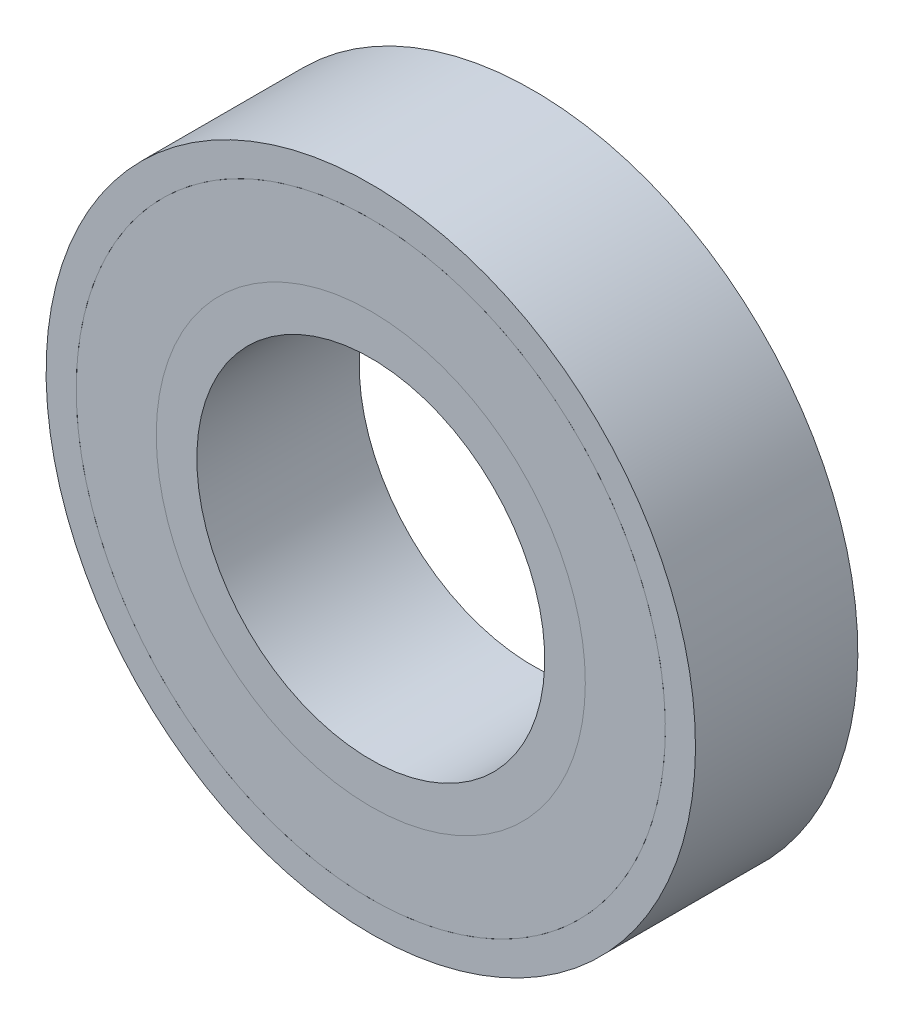
ISO-10303-21;
HEADER;
FILE_DESCRIPTION(('STEP AP214'),'2;1');
FILE_NAME('part.step','',(''),(''),'','','');
FILE_SCHEMA(('AUTOMOTIVE_DESIGN { 1 0 10303 214 1 1 1 1 }'));
ENDSEC;
DATA;
#1=APPLICATION_CONTEXT('core data for automotive mechanical design processes');
#2=APPLICATION_PROTOCOL_DEFINITION('international standard','automotive_design',2000,#1);
#3=PRODUCT_CONTEXT('',#1,'mechanical');
#4=PRODUCT('Part','Part','',(#3));
#5=PRODUCT_RELATED_PRODUCT_CATEGORY('part','',(#4));
#6=PRODUCT_DEFINITION_FORMATION('','',#4);
#7=PRODUCT_DEFINITION_CONTEXT('part definition',#1,'design');
#8=PRODUCT_DEFINITION('design','',#6,#7);
#9=PRODUCT_DEFINITION_SHAPE('','',#8);
#10=(LENGTH_UNIT() NAMED_UNIT(*) SI_UNIT(.MILLI.,.METRE.));
#11=(NAMED_UNIT(*) PLANE_ANGLE_UNIT() SI_UNIT($,.RADIAN.));
#12=(NAMED_UNIT(*) SI_UNIT($,.STERADIAN.) SOLID_ANGLE_UNIT());
#13=UNCERTAINTY_MEASURE_WITH_UNIT(LENGTH_MEASURE(1.E-05),#10,'distance_accuracy_value','');
#14=(GEOMETRIC_REPRESENTATION_CONTEXT(3) GLOBAL_UNCERTAINTY_ASSIGNED_CONTEXT((#13)) GLOBAL_UNIT_ASSIGNED_CONTEXT((#10,
#11,#12)) REPRESENTATION_CONTEXT('',''));
#15=CARTESIAN_POINT('',(0.,0.,0.));
#16=DIRECTION('',(0.,0.,1.));
#17=DIRECTION('',(1.,0.,0.));
#18=AXIS2_PLACEMENT_3D('',#15,#16,#17);
#19=CARTESIAN_POINT('',(0.,0.,86.2));
#20=DIRECTION('',(0.,0.,-1.));
#21=DIRECTION('',(0.479150850992456,0.877732568606865,0.));
#22=AXIS2_PLACEMENT_3D('',#19,#20,#21);
#23=PLANE('',#22);
#24=CARTESIAN_POINT('',(0.,0.,86.2));
#25=DIRECTION('',(0.,0.,1.));
#26=DIRECTION('',(0.479150850992456,0.877732568606865,0.));
#27=AXIS2_PLACEMENT_3D('',#24,#25,#26);
#28=CIRCLE('',#27,12.7);
#29=CARTESIAN_POINT('',(-6.08521580760419,-11.1472036213072,86.2));
#30=VERTEX_POINT('',#29);
#31=EDGE_CURVE('E101',#30,#30,#28,.T.);
#32=ORIENTED_EDGE('',*,*,#31,.F.);
#33=EDGE_LOOP('',(#32));
#34=FACE_BOUND('',#33,.T.);
#35=CARTESIAN_POINT('',(0.,0.,86.2));
#36=DIRECTION('',(0.,0.,-1.));
#37=DIRECTION('',(-0.479150850992456,-0.877732568606865,0.));
#38=AXIS2_PLACEMENT_3D('',#35,#36,#37);
#39=CIRCLE('',#38,14.);
#40=CARTESIAN_POINT('',(6.70811191389439,12.2882559604961,86.2));
#41=VERTEX_POINT('',#40);
#42=EDGE_CURVE('E12',#41,#41,#39,.T.);
#43=ORIENTED_EDGE('',*,*,#42,.F.);
#44=EDGE_LOOP('',(#43));
#45=FACE_BOUND('',#44,.T.);
#46=ADVANCED_FACE('F63',(#34,#45),#23,.F.);
#47=CARTESIAN_POINT('',(0.,0.,79.2));
#48=DIRECTION('',(0.,0.,-1.));
#49=DIRECTION('',(0.479150850992456,0.877732568606865,0.));
#50=AXIS2_PLACEMENT_3D('',#47,#48,#49);
#51=PLANE('',#50);
#52=CARTESIAN_POINT('',(0.,0.,79.2));
#53=DIRECTION('',(0.,0.,1.));
#54=DIRECTION('',(0.479150850992456,0.877732568606865,0.));
#55=AXIS2_PLACEMENT_3D('',#52,#53,#54);
#56=CIRCLE('',#55,12.7);
#57=CARTESIAN_POINT('',(-6.08521580760419,-11.1472036213072,79.2));
#58=VERTEX_POINT('',#57);
#59=EDGE_CURVE('E105',#58,#58,#56,.T.);
#60=ORIENTED_EDGE('',*,*,#59,.T.);
#61=EDGE_LOOP('',(#60));
#62=FACE_BOUND('',#61,.T.);
#63=CARTESIAN_POINT('',(0.,0.,79.2));
#64=DIRECTION('',(0.,0.,-1.));
#65=DIRECTION('',(-0.479150850992456,-0.877732568606865,0.));
#66=AXIS2_PLACEMENT_3D('',#63,#64,#65);
#67=CIRCLE('',#66,14.);
#68=CARTESIAN_POINT('',(6.70811191389439,12.2882559604961,79.2));
#69=VERTEX_POINT('',#68);
#70=EDGE_CURVE('E113',#69,#69,#67,.T.);
#71=ORIENTED_EDGE('',*,*,#70,.T.);
#72=EDGE_LOOP('',(#71));
#73=FACE_BOUND('',#72,.T.);
#74=ADVANCED_FACE('F109',(#62,#73),#51,.T.);
#75=CARTESIAN_POINT('',(0.,0.,86.2));
#76=DIRECTION('',(0.,0.,-1.));
#77=DIRECTION('',(-0.479150850992456,-0.877732568606865,0.));
#78=AXIS2_PLACEMENT_3D('',#75,#76,#77);
#79=CYLINDRICAL_SURFACE('',#78,14.);
#80=ORIENTED_EDGE('',*,*,#70,.F.);
#81=DIRECTION('',(0.,0.,1.));
#82=VECTOR('',#81,1.);
#83=CARTESIAN_POINT('',(6.70811191389439,12.2882559604961,86.2));
#84=LINE('',#83,#82);
#85=EDGE_CURVE('E70',#69,#41,#84,.T.);
#86=ORIENTED_EDGE('',*,*,#85,.T.);
#87=ORIENTED_EDGE('',*,*,#42,.T.);
#88=ORIENTED_EDGE('',*,*,#85,.F.);
#89=EDGE_LOOP('',(#80,#86,#87,#88));
#90=FACE_BOUND('',#89,.T.);
#91=ADVANCED_FACE('F123',(#90),#79,.T.);
#92=CARTESIAN_POINT('',(0.,0.,86.2));
#93=DIRECTION('',(0.,0.,-1.));
#94=DIRECTION('',(0.479150850992456,0.877732568606865,0.));
#95=AXIS2_PLACEMENT_3D('',#92,#93,#94);
#96=CYLINDRICAL_SURFACE('',#95,12.7);
#97=ORIENTED_EDGE('',*,*,#59,.F.);
#98=DIRECTION('',(0.,0.,1.));
#99=VECTOR('',#98,1.);
#100=CARTESIAN_POINT('',(-6.08521580760419,-11.1472036213072,86.2));
#101=LINE('',#100,#99);
#102=EDGE_CURVE('E98',#58,#30,#101,.T.);
#103=ORIENTED_EDGE('',*,*,#102,.T.);
#104=ORIENTED_EDGE('',*,*,#31,.T.);
#105=ORIENTED_EDGE('',*,*,#102,.F.);
#106=EDGE_LOOP('',(#97,#103,#104,#105));
#107=FACE_BOUND('',#106,.T.);
#108=ADVANCED_FACE('F102',(#107),#96,.F.);
#109=CLOSED_SHELL('',(#46,#74,#91,#108));
#110=MANIFOLD_SOLID_BREP('B2',#109);
#111=CARTESIAN_POINT('',(0.,0.,86.2));
#112=DIRECTION('',(0.,0.,-1.));
#113=DIRECTION('',(0.479150850992456,0.877732568606865,0.));
#114=AXIS2_PLACEMENT_3D('',#111,#112,#113);
#115=PLANE('',#114);
#116=CARTESIAN_POINT('',(0.,0.,86.2));
#117=DIRECTION('',(0.,0.,1.));
#118=DIRECTION('',(0.479150850992456,0.877732568606865,0.));
#119=AXIS2_PLACEMENT_3D('',#116,#117,#118);
#120=CIRCLE('',#119,7.5);
#121=CARTESIAN_POINT('',(-3.59363138244342,-6.58299426455149,86.2));
#122=VERTEX_POINT('',#121);
#123=EDGE_CURVE('E240',#122,#122,#120,.T.);
#124=ORIENTED_EDGE('',*,*,#123,.F.);
#125=EDGE_LOOP('',(#124));
#126=FACE_BOUND('',#125,.T.);
#127=CARTESIAN_POINT('',(0.,0.,86.2));
#128=DIRECTION('',(0.,0.,-1.));
#129=DIRECTION('',(-0.479150850992456,-0.877732568606865,0.));
#130=AXIS2_PLACEMENT_3D('',#127,#128,#129);
#131=CIRCLE('',#130,9.25);
#132=CARTESIAN_POINT('',(4.43214537168022,8.1190262596135,86.2));
#133=VERTEX_POINT('',#132);
#134=EDGE_CURVE('E62',#133,#133,#131,.T.);
#135=ORIENTED_EDGE('',*,*,#134,.F.);
#136=EDGE_LOOP('',(#135));
#137=FACE_BOUND('',#136,.T.);
#138=ADVANCED_FACE('F197',(#126,#137),#115,.F.);
#139=CARTESIAN_POINT('',(0.,0.,79.2));
#140=DIRECTION('',(0.,0.,-1.));
#141=DIRECTION('',(0.479150850992456,0.877732568606865,0.));
#142=AXIS2_PLACEMENT_3D('',#139,#140,#141);
#143=PLANE('',#142);
#144=CARTESIAN_POINT('',(0.,0.,79.2));
#145=DIRECTION('',(0.,0.,1.));
#146=DIRECTION('',(0.479150850992456,0.877732568606865,0.));
#147=AXIS2_PLACEMENT_3D('',#144,#145,#146);
#148=CIRCLE('',#147,7.5);
#149=CARTESIAN_POINT('',(-3.59363138244342,-6.58299426455149,79.2));
#150=VERTEX_POINT('',#149);
#151=EDGE_CURVE('E234',#150,#150,#148,.T.);
#152=ORIENTED_EDGE('',*,*,#151,.T.);
#153=EDGE_LOOP('',(#152));
#154=FACE_BOUND('',#153,.T.);
#155=CARTESIAN_POINT('',(0.,0.,79.2));
#156=DIRECTION('',(0.,0.,-1.));
#157=DIRECTION('',(-0.479150850992456,-0.877732568606865,0.));
#158=AXIS2_PLACEMENT_3D('',#155,#156,#157);
#159=CIRCLE('',#158,9.25);
#160=CARTESIAN_POINT('',(4.43214537168022,8.1190262596135,79.2));
#161=VERTEX_POINT('',#160);
#162=EDGE_CURVE('E246',#161,#161,#159,.T.);
#163=ORIENTED_EDGE('',*,*,#162,.T.);
#164=EDGE_LOOP('',(#163));
#165=FACE_BOUND('',#164,.T.);
#166=ADVANCED_FACE('F241',(#154,#165),#143,.T.);
#167=CARTESIAN_POINT('',(0.,0.,86.2));
#168=DIRECTION('',(0.,0.,-1.));
#169=DIRECTION('',(-0.479150850992456,-0.877732568606865,0.));
#170=AXIS2_PLACEMENT_3D('',#167,#168,#169);
#171=CYLINDRICAL_SURFACE('',#170,9.25);
#172=ORIENTED_EDGE('',*,*,#162,.F.);
#173=DIRECTION('',(0.,0.,1.));
#174=VECTOR('',#173,1.);
#175=CARTESIAN_POINT('',(4.43214537168022,8.1190262596135,86.2));
#176=LINE('',#175,#174);
#177=EDGE_CURVE('E200',#161,#133,#176,.T.);
#178=ORIENTED_EDGE('',*,*,#177,.T.);
#179=ORIENTED_EDGE('',*,*,#134,.T.);
#180=ORIENTED_EDGE('',*,*,#177,.F.);
#181=EDGE_LOOP('',(#172,#178,#179,#180));
#182=FACE_BOUND('',#181,.T.);
#183=ADVANCED_FACE('F253',(#182),#171,.T.);
#184=CARTESIAN_POINT('',(0.,0.,86.2));
#185=DIRECTION('',(0.,0.,-1.));
#186=DIRECTION('',(0.479150850992456,0.877732568606865,0.));
#187=AXIS2_PLACEMENT_3D('',#184,#185,#186);
#188=CYLINDRICAL_SURFACE('',#187,7.5);
#189=ORIENTED_EDGE('',*,*,#151,.F.);
#190=DIRECTION('',(0.,0.,1.));
#191=VECTOR('',#190,1.);
#192=CARTESIAN_POINT('',(-3.59363138244342,-6.58299426455149,86.2));
#193=LINE('',#192,#191);
#194=EDGE_CURVE('E235',#150,#122,#193,.T.);
#195=ORIENTED_EDGE('',*,*,#194,.T.);
#196=ORIENTED_EDGE('',*,*,#123,.T.);
#197=ORIENTED_EDGE('',*,*,#194,.F.);
#198=EDGE_LOOP('',(#189,#195,#196,#197));
#199=FACE_BOUND('',#198,.T.);
#200=ADVANCED_FACE('F233',(#199),#188,.F.);
#201=CLOSED_SHELL('',(#138,#166,#183,#200));
#202=MANIFOLD_SOLID_BREP('B6',#201);
#203=CARTESIAN_POINT('',(0.,0.,86.2));
#204=DIRECTION('',(0.,0.,-1.));
#205=DIRECTION('',(0.479150850992456,0.877732568606865,0.));
#206=AXIS2_PLACEMENT_3D('',#203,#204,#205);
#207=PLANE('',#206);
#208=CARTESIAN_POINT('',(0.,0.,86.2));
#209=DIRECTION('',(0.,0.,1.));
#210=DIRECTION('',(0.479150850992456,0.877732568606865,0.));
#211=AXIS2_PLACEMENT_3D('',#208,#209,#210);
#212=CIRCLE('',#211,9.25);
#213=CARTESIAN_POINT('',(-4.43214537168022,-8.1190262596135,86.2));
#214=VERTEX_POINT('',#213);
#215=EDGE_CURVE('E359',#214,#214,#212,.T.);
#216=ORIENTED_EDGE('',*,*,#215,.F.);
#217=EDGE_LOOP('',(#216));
#218=FACE_BOUND('',#217,.T.);
#219=CARTESIAN_POINT('',(0.,0.,86.2));
#220=DIRECTION('',(0.,0.,-1.));
#221=DIRECTION('',(-0.479150850992456,-0.877732568606865,0.));
#222=AXIS2_PLACEMENT_3D('',#219,#220,#221);
#223=CIRCLE('',#222,12.7);
#224=CARTESIAN_POINT('',(6.08521580760419,11.1472036213072,86.2));
#225=VERTEX_POINT('',#224);
#226=EDGE_CURVE('E193',#225,#225,#223,.T.);
#227=ORIENTED_EDGE('',*,*,#226,.F.);
#228=EDGE_LOOP('',(#227));
#229=FACE_BOUND('',#228,.T.);
#230=ADVANCED_FACE('F321',(#218,#229),#207,.F.);
#231=CARTESIAN_POINT('',(0.,0.,79.2));
#232=DIRECTION('',(0.,0.,-1.));
#233=DIRECTION('',(0.479150850992456,0.877732568606865,0.));
#234=AXIS2_PLACEMENT_3D('',#231,#232,#233);
#235=PLANE('',#234);
#236=CARTESIAN_POINT('',(0.,0.,79.2));
#237=DIRECTION('',(0.,0.,1.));
#238=DIRECTION('',(0.479150850992456,0.877732568606865,0.));
#239=AXIS2_PLACEMENT_3D('',#236,#237,#238);
#240=CIRCLE('',#239,9.25);
#241=CARTESIAN_POINT('',(-4.43214537168022,-8.1190262596135,79.2));
#242=VERTEX_POINT('',#241);
#243=EDGE_CURVE('E358',#242,#242,#240,.T.);
#244=ORIENTED_EDGE('',*,*,#243,.T.);
#245=EDGE_LOOP('',(#244));
#246=FACE_BOUND('',#245,.T.);
#247=CARTESIAN_POINT('',(0.,0.,79.2));
#248=DIRECTION('',(0.,0.,-1.));
#249=DIRECTION('',(-0.479150850992456,-0.877732568606865,0.));
#250=AXIS2_PLACEMENT_3D('',#247,#248,#249);
#251=CIRCLE('',#250,12.7);
#252=CARTESIAN_POINT('',(6.08521580760419,11.1472036213072,79.2));
#253=VERTEX_POINT('',#252);
#254=EDGE_CURVE('E372',#253,#253,#251,.T.);
#255=ORIENTED_EDGE('',*,*,#254,.T.);
#256=EDGE_LOOP('',(#255));
#257=FACE_BOUND('',#256,.T.);
#258=ADVANCED_FACE('F362',(#246,#257),#235,.T.);
#259=CARTESIAN_POINT('',(0.,0.,86.2));
#260=DIRECTION('',(0.,0.,-1.));
#261=DIRECTION('',(-0.479150850992456,-0.877732568606865,0.));
#262=AXIS2_PLACEMENT_3D('',#259,#260,#261);
#263=CYLINDRICAL_SURFACE('',#262,12.7);
#264=ORIENTED_EDGE('',*,*,#254,.F.);
#265=DIRECTION('',(0.,0.,1.));
#266=VECTOR('',#265,1.);
#267=CARTESIAN_POINT('',(6.08521580760419,11.1472036213072,86.2));
#268=LINE('',#267,#266);
#269=EDGE_CURVE('E326',#253,#225,#268,.T.);
#270=ORIENTED_EDGE('',*,*,#269,.T.);
#271=ORIENTED_EDGE('',*,*,#226,.T.);
#272=ORIENTED_EDGE('',*,*,#269,.F.);
#273=EDGE_LOOP('',(#264,#270,#271,#272));
#274=FACE_BOUND('',#273,.T.);
#275=ADVANCED_FACE('F377',(#274),#263,.T.);
#276=CARTESIAN_POINT('',(0.,0.,86.2));
#277=DIRECTION('',(0.,0.,-1.));
#278=DIRECTION('',(0.479150850992456,0.877732568606865,0.));
#279=AXIS2_PLACEMENT_3D('',#276,#277,#278);
#280=CYLINDRICAL_SURFACE('',#279,9.25);
#281=ORIENTED_EDGE('',*,*,#243,.F.);
#282=DIRECTION('',(0.,0.,1.));
#283=VECTOR('',#282,1.);
#284=CARTESIAN_POINT('',(-4.43214537168022,-8.1190262596135,86.2));
#285=LINE('',#284,#283);
#286=EDGE_CURVE('E352',#242,#214,#285,.T.);
#287=ORIENTED_EDGE('',*,*,#286,.T.);
#288=ORIENTED_EDGE('',*,*,#215,.T.);
#289=ORIENTED_EDGE('',*,*,#286,.F.);
#290=EDGE_LOOP('',(#281,#287,#288,#289));
#291=FACE_BOUND('',#290,.T.);
#292=ADVANCED_FACE('F360',(#291),#280,.F.);
#293=CLOSED_SHELL('',(#230,#258,#275,#292));
#294=MANIFOLD_SOLID_BREP('B57',#293);
#295=ADVANCED_BREP_SHAPE_REPRESENTATION('',(#18,#110,#202,#294),#14);
#296=SHAPE_DEFINITION_REPRESENTATION(#9,#295);
ENDSEC;
END-ISO-10303-21;
